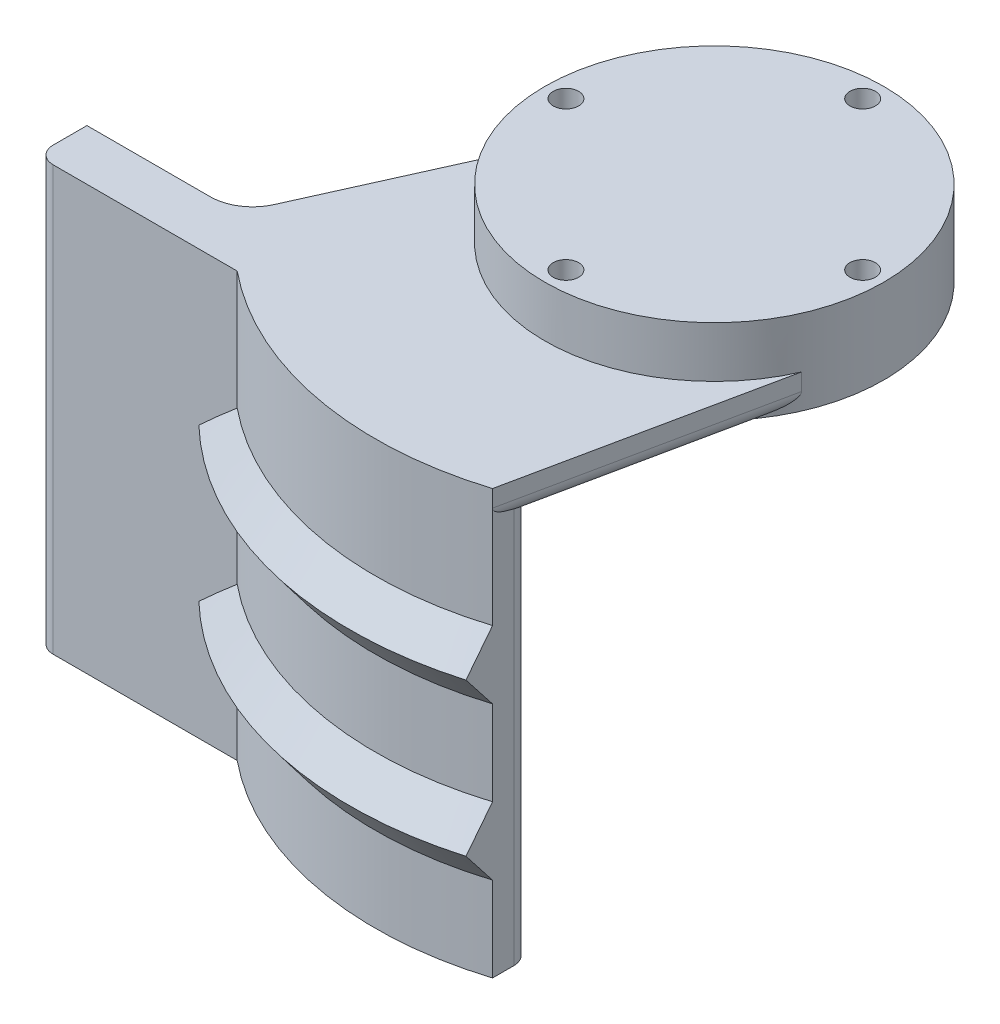
ISO-10303-21;
HEADER;
FILE_DESCRIPTION(('STEP AP214'),'2;1');
FILE_NAME('part.step','',(''),(''),'','','');
FILE_SCHEMA(('AUTOMOTIVE_DESIGN { 1 0 10303 214 1 1 1 1 }'));
ENDSEC;
DATA;
#1=APPLICATION_CONTEXT('core data for automotive mechanical design processes');
#2=APPLICATION_PROTOCOL_DEFINITION('international standard','automotive_design',2000,#1);
#3=PRODUCT_CONTEXT('',#1,'mechanical');
#4=PRODUCT('Part','Part','',(#3));
#5=PRODUCT_RELATED_PRODUCT_CATEGORY('part','',(#4));
#6=PRODUCT_DEFINITION_FORMATION('','',#4);
#7=PRODUCT_DEFINITION_CONTEXT('part definition',#1,'design');
#8=PRODUCT_DEFINITION('design','',#6,#7);
#9=PRODUCT_DEFINITION_SHAPE('','',#8);
#10=(LENGTH_UNIT() NAMED_UNIT(*) SI_UNIT(.MILLI.,.METRE.));
#11=(NAMED_UNIT(*) PLANE_ANGLE_UNIT() SI_UNIT($,.RADIAN.));
#12=(NAMED_UNIT(*) SI_UNIT($,.STERADIAN.) SOLID_ANGLE_UNIT());
#13=UNCERTAINTY_MEASURE_WITH_UNIT(LENGTH_MEASURE(1.E-05),#10,'distance_accuracy_value','');
#14=(GEOMETRIC_REPRESENTATION_CONTEXT(3) GLOBAL_UNCERTAINTY_ASSIGNED_CONTEXT((#13)) GLOBAL_UNIT_ASSIGNED_CONTEXT((#10,
#11,#12)) REPRESENTATION_CONTEXT('',''));
#15=CARTESIAN_POINT('',(0.,0.,0.));
#16=DIRECTION('',(0.,0.,1.));
#17=DIRECTION('',(1.,0.,0.));
#18=AXIS2_PLACEMENT_3D('',#15,#16,#17);
#19=CARTESIAN_POINT('',(0.,4.,0.));
#20=DIRECTION('',(0.,-1.,0.));
#21=DIRECTION('',(0.,0.,-1.));
#22=AXIS2_PLACEMENT_3D('',#19,#20,#21);
#23=CYLINDRICAL_SURFACE('',#22,40.);
#24=DIRECTION('',(0.,1.,0.));
#25=VECTOR('',#24,1.);
#26=CARTESIAN_POINT('',(12.,-50.,38.1575680566778));
#27=LINE('',#26,#25);
#28=CARTESIAN_POINT('',(12.,-46.,38.1575680566778));
#29=VERTEX_POINT('',#28);
#30=CARTESIAN_POINT('',(12.,-36.,38.1575680566778));
#31=VERTEX_POINT('',#30);
#32=EDGE_CURVE('E248',#29,#31,#27,.T.);
#33=ORIENTED_EDGE('',*,*,#32,.T.);
#34=CARTESIAN_POINT('',(0.,-36.,0.));
#35=DIRECTION('',(0.,1.,0.));
#36=DIRECTION('',(0.,0.,1.));
#37=AXIS2_PLACEMENT_3D('',#34,#35,#36);
#38=CIRCLE('',#37,40.);
#39=CARTESIAN_POINT('',(-25.2784493195291,-36.,31.));
#40=VERTEX_POINT('',#39);
#41=EDGE_CURVE('E140',#40,#31,#38,.T.);
#42=ORIENTED_EDGE('',*,*,#41,.F.);
#43=DIRECTION('',(0.,1.,0.));
#44=VECTOR('',#43,1.);
#45=CARTESIAN_POINT('',(-25.2784493195291,-46.,31.));
#46=LINE('',#45,#44);
#47=CARTESIAN_POINT('',(-25.2784493195291,-46.,31.));
#48=VERTEX_POINT('',#47);
#49=EDGE_CURVE('E163',#48,#40,#46,.T.);
#50=ORIENTED_EDGE('',*,*,#49,.F.);
#51=CARTESIAN_POINT('',(0.,-46.,0.));
#52=DIRECTION('',(0.,-1.,0.));
#53=DIRECTION('',(0.,0.,-1.));
#54=AXIS2_PLACEMENT_3D('',#51,#52,#53);
#55=CIRCLE('',#54,40.);
#56=EDGE_CURVE('E197',#48,#29,#55,.F.);
#57=ORIENTED_EDGE('',*,*,#56,.T.);
#58=EDGE_LOOP('',(#33,#42,#50,#57));
#59=FACE_BOUND('',#58,.T.);
#60=ADVANCED_FACE('F17',(#59),#23,.T.);
#61=CARTESIAN_POINT('',(0.,-32.,0.));
#62=DIRECTION('',(0.,1.,0.));
#63=DIRECTION('',(0.,0.,1.));
#64=AXIS2_PLACEMENT_3D('',#61,#62,#63);
#65=CONICAL_SURFACE('',#64,43.,0.643501108793284);
#66=CARTESIAN_POINT('',(12.,-36.,38.1575680566778));
#67=CARTESIAN_POINT('',(12.,-35.6671021168633,38.419296554204));
#68=CARTESIAN_POINT('',(12.,-35.3340868393737,38.6808757051275));
#69=CARTESIAN_POINT('',(12.,-34.6678346429777,39.2037511531911));
#70=CARTESIAN_POINT('',(12.,-34.334597724214,39.4650474505128));
#71=CARTESIAN_POINT('',(12.,-33.6679149859085,39.9873733504999));
#72=CARTESIAN_POINT('',(12.,-33.3344691663803,40.2484029531825));
#73=CARTESIAN_POINT('',(12.,-32.6673798864232,40.7702099359587));
#74=CARTESIAN_POINT('',(12.,-32.3337364258673,41.03098731589));
#75=CARTESIAN_POINT('',(12.,-32.,41.2916456441252));
#76=B_SPLINE_CURVE_WITH_KNOTS('',3,(#66,#67,#68,#69,#70,#71,#72,#73,#74,#75),.UNSPECIFIED.,.F.,
.F.,(4,2,2,2,4),(0.,1.27039564165171,2.54079046617746,3.81118520828206,5.08158076742941),.UNSPECIFIED.);
#77=CARTESIAN_POINT('',(12.,-32.,41.2916456441252));
#78=VERTEX_POINT('',#77);
#79=EDGE_CURVE('E150',#31,#78,#76,.T.);
#80=ORIENTED_EDGE('',*,*,#79,.T.);
#81=CARTESIAN_POINT('',(0.,-32.,0.));
#82=DIRECTION('',(0.,-1.,0.));
#83=DIRECTION('',(0.,0.,-1.));
#84=AXIS2_PLACEMENT_3D('',#81,#82,#83);
#85=CIRCLE('',#84,43.);
#86=CARTESIAN_POINT('',(-29.7993288515027,-32.,31.));
#87=VERTEX_POINT('',#86);
#88=EDGE_CURVE('E146',#87,#78,#85,.F.);
#89=ORIENTED_EDGE('',*,*,#88,.F.);
#90=CARTESIAN_POINT('',(-25.2784493195291,-36.,31.));
#91=CARTESIAN_POINT('',(-25.6631878364132,-35.6758002490935,31.));
#92=CARTESIAN_POINT('',(-26.0457436005517,-35.3490211030429,31.));
#93=CARTESIAN_POINT('',(-26.8067290436112,-34.6907909780192,31.));
#94=CARTESIAN_POINT('',(-27.1851592527072,-34.3593406122014,31.));
#95=CARTESIAN_POINT('',(-27.9382273306498,-33.6921754070855,31.));
#96=CARTESIAN_POINT('',(-28.31286525586,-33.3564606313356,31.));
#97=CARTESIAN_POINT('',(-29.0586582065725,-32.6810864184569,31.));
#98=CARTESIAN_POINT('',(-29.4298127728088,-32.3414264740257,31.));
#99=CARTESIAN_POINT('',(-29.7993288515027,-32.,31.));
#100=B_SPLINE_CURVE_WITH_KNOTS('',3,(#90,#91,#92,#93,#94,#95,#96,#97,#98,#99),.UNSPECIFIED.,.F.,
.F.,(4,2,2,2,4),(0.,1.50933691884322,3.01847753046414,4.5275956791798,6.03691007979028),.UNSPECIFIED.);
#101=EDGE_CURVE('E21',#40,#87,#100,.T.);
#102=ORIENTED_EDGE('',*,*,#101,.F.);
#103=ORIENTED_EDGE('',*,*,#41,.T.);
#104=EDGE_LOOP('',(#80,#89,#102,#103));
#105=FACE_BOUND('',#104,.T.);
#106=ADVANCED_FACE('F148',(#105),#65,.T.);
#107=CARTESIAN_POINT('',(0.,-32.,0.));
#108=DIRECTION('',(0.,-1.,0.));
#109=DIRECTION('',(0.,0.,-1.));
#110=AXIS2_PLACEMENT_3D('',#107,#108,#109);
#111=CONICAL_SURFACE('',#110,43.,0.643501108793284);
#112=ORIENTED_EDGE('',*,*,#88,.T.);
#113=CARTESIAN_POINT('',(12.,-32.,41.2916456441252));
#114=CARTESIAN_POINT('',(12.,-31.6662635741327,41.03098731589));
#115=CARTESIAN_POINT('',(12.,-31.3326201135769,40.7702099359587));
#116=CARTESIAN_POINT('',(12.,-30.6655308336197,40.2484029531825));
#117=CARTESIAN_POINT('',(12.,-30.3320850140915,39.9873733504999));
#118=CARTESIAN_POINT('',(12.,-29.665402275786,39.4650474505128));
#119=CARTESIAN_POINT('',(12.,-29.3321653570223,39.2037511531911));
#120=CARTESIAN_POINT('',(12.,-28.6659131606263,38.6808757051275));
#121=CARTESIAN_POINT('',(12.,-28.3328978831367,38.419296554204));
#122=CARTESIAN_POINT('',(12.,-28.,38.1575680566778));
#123=B_SPLINE_CURVE_WITH_KNOTS('',3,(#113,#114,#115,#116,#117,#118,#119,#120,#121,#122),
.UNSPECIFIED.,.F.,.F.,(4,2,2,2,4),(0.,1.27039555914734,2.54079030125196,3.81118512577771,
5.08158076742942),.UNSPECIFIED.);
#124=CARTESIAN_POINT('',(12.,-28.,38.1575680566778));
#125=VERTEX_POINT('',#124);
#126=EDGE_CURVE('E239',#78,#125,#123,.T.);
#127=ORIENTED_EDGE('',*,*,#126,.T.);
#128=CARTESIAN_POINT('',(0.,-28.,0.));
#129=DIRECTION('',(0.,-1.,0.));
#130=DIRECTION('',(0.,0.,-1.));
#131=AXIS2_PLACEMENT_3D('',#128,#129,#130);
#132=CIRCLE('',#131,40.);
#133=CARTESIAN_POINT('',(-25.2784493195291,-28.,31.));
#134=VERTEX_POINT('',#133);
#135=EDGE_CURVE('E155',#134,#125,#132,.F.);
#136=ORIENTED_EDGE('',*,*,#135,.F.);
#137=CARTESIAN_POINT('',(-29.7993288515027,-32.,31.));
#138=CARTESIAN_POINT('',(-29.4298127728088,-31.6585735259743,31.));
#139=CARTESIAN_POINT('',(-29.0586582065725,-31.3189135815431,31.));
#140=CARTESIAN_POINT('',(-28.31286525586,-30.6435393686644,31.));
#141=CARTESIAN_POINT('',(-27.9382273306498,-30.3078245929145,31.));
#142=CARTESIAN_POINT('',(-27.1851592527072,-29.6406593877986,31.));
#143=CARTESIAN_POINT('',(-26.8067290436112,-29.3092090219808,31.));
#144=CARTESIAN_POINT('',(-26.0457436005517,-28.6509788969571,31.));
#145=CARTESIAN_POINT('',(-25.6631878364132,-28.3241997509065,31.));
#146=CARTESIAN_POINT('',(-25.2784493195291,-28.,31.));
#147=B_SPLINE_CURVE_WITH_KNOTS('',3,(#137,#138,#139,#140,#141,#142,#143,#144,#145,#146),
.UNSPECIFIED.,.F.,.F.,(4,2,2,2,4),(0.,1.50931440061047,3.01843254932613,4.52757316094704,
6.03691007979026),.UNSPECIFIED.);
#148=EDGE_CURVE('E160',#87,#134,#147,.T.);
#149=ORIENTED_EDGE('',*,*,#148,.F.);
#150=EDGE_LOOP('',(#112,#127,#136,#149));
#151=FACE_BOUND('',#150,.T.);
#152=ADVANCED_FACE('F164',(#151),#111,.T.);
#153=CARTESIAN_POINT('',(0.,4.,0.));
#154=DIRECTION('',(0.,-1.,0.));
#155=DIRECTION('',(0.,0.,-1.));
#156=AXIS2_PLACEMENT_3D('',#153,#154,#155);
#157=CYLINDRICAL_SURFACE('',#156,40.);
#158=DIRECTION('',(0.,1.,0.));
#159=VECTOR('',#158,1.);
#160=CARTESIAN_POINT('',(12.,-50.,38.1575680566778));
#161=LINE('',#160,#159);
#162=CARTESIAN_POINT('',(12.,-18.,38.1575680566778));
#163=VERTEX_POINT('',#162);
#164=EDGE_CURVE('E243',#125,#163,#161,.T.);
#165=ORIENTED_EDGE('',*,*,#164,.T.);
#166=CARTESIAN_POINT('',(0.,-18.,0.));
#167=DIRECTION('',(0.,1.,0.));
#168=DIRECTION('',(0.,0.,1.));
#169=AXIS2_PLACEMENT_3D('',#166,#167,#168);
#170=CIRCLE('',#169,40.);
#171=CARTESIAN_POINT('',(-25.2784493195291,-18.,31.));
#172=VERTEX_POINT('',#171);
#173=EDGE_CURVE('E392',#172,#163,#170,.T.);
#174=ORIENTED_EDGE('',*,*,#173,.F.);
#175=DIRECTION('',(0.,1.,0.));
#176=VECTOR('',#175,1.);
#177=CARTESIAN_POINT('',(-25.2784493195291,-46.,31.));
#178=LINE('',#177,#176);
#179=EDGE_CURVE('E166',#134,#172,#178,.T.);
#180=ORIENTED_EDGE('',*,*,#179,.F.);
#181=ORIENTED_EDGE('',*,*,#135,.T.);
#182=EDGE_LOOP('',(#165,#174,#180,#181));
#183=FACE_BOUND('',#182,.T.);
#184=ADVANCED_FACE('F527',(#183),#157,.T.);
#185=CARTESIAN_POINT('',(0.,-14.,0.));
#186=DIRECTION('',(0.,1.,0.));
#187=DIRECTION('',(0.,0.,1.));
#188=AXIS2_PLACEMENT_3D('',#185,#186,#187);
#189=CONICAL_SURFACE('',#188,43.,0.643501108793285);
#190=CARTESIAN_POINT('',(12.,-18.,38.1575680566778));
#191=CARTESIAN_POINT('',(12.,-17.6671021168633,38.419296554204));
#192=CARTESIAN_POINT('',(12.,-17.3340868393737,38.6808757051275));
#193=CARTESIAN_POINT('',(12.,-16.6678346429777,39.2037511531911));
#194=CARTESIAN_POINT('',(12.,-16.334597724214,39.4650474505128));
#195=CARTESIAN_POINT('',(12.,-15.6679149859085,39.9873733504999));
#196=CARTESIAN_POINT('',(12.,-15.3344691663803,40.2484029531825));
#197=CARTESIAN_POINT('',(12.,-14.6673798864232,40.7702099359587));
#198=CARTESIAN_POINT('',(12.,-14.3337364258673,41.03098731589));
#199=CARTESIAN_POINT('',(12.,-14.,41.2916456441252));
#200=B_SPLINE_CURVE_WITH_KNOTS('',3,(#190,#191,#192,#193,#194,#195,#196,#197,#198,#199),
.UNSPECIFIED.,.F.,.F.,(4,2,2,2,4),(0.,1.27039564165171,2.54079046617745,3.81118520828205,
5.0815807674294),.UNSPECIFIED.);
#201=CARTESIAN_POINT('',(12.,-14.,41.2916456441252));
#202=VERTEX_POINT('',#201);
#203=EDGE_CURVE('E217',#163,#202,#200,.T.);
#204=ORIENTED_EDGE('',*,*,#203,.T.);
#205=CARTESIAN_POINT('',(0.,-14.,0.));
#206=DIRECTION('',(0.,-1.,0.));
#207=DIRECTION('',(0.,0.,-1.));
#208=AXIS2_PLACEMENT_3D('',#205,#206,#207);
#209=CIRCLE('',#208,43.);
#210=CARTESIAN_POINT('',(-29.7993288515027,-14.,31.));
#211=VERTEX_POINT('',#210);
#212=EDGE_CURVE('E385',#211,#202,#209,.F.);
#213=ORIENTED_EDGE('',*,*,#212,.F.);
#214=CARTESIAN_POINT('',(-25.2784493195291,-18.,31.));
#215=CARTESIAN_POINT('',(-25.6631878364132,-17.6758002490935,31.));
#216=CARTESIAN_POINT('',(-26.0457436005517,-17.3490211030429,31.));
#217=CARTESIAN_POINT('',(-26.8067290436112,-16.6907909780192,31.));
#218=CARTESIAN_POINT('',(-27.1851592527072,-16.3593406122014,31.));
#219=CARTESIAN_POINT('',(-27.9382273306498,-15.6921754070855,31.));
#220=CARTESIAN_POINT('',(-28.31286525586,-15.3564606313356,31.));
#221=CARTESIAN_POINT('',(-29.0586582065725,-14.6810864184569,31.));
#222=CARTESIAN_POINT('',(-29.4298127728088,-14.3414264740257,31.));
#223=CARTESIAN_POINT('',(-29.7993288515027,-14.,31.));
#224=B_SPLINE_CURVE_WITH_KNOTS('',3,(#214,#215,#216,#217,#218,#219,#220,#221,#222,#223),
.UNSPECIFIED.,.F.,.F.,(4,2,2,2,4),(0.,1.50933691884322,3.01847753046413,4.52759567917979,
6.03691007979027),.UNSPECIFIED.);
#225=EDGE_CURVE('E167',#172,#211,#224,.T.);
#226=ORIENTED_EDGE('',*,*,#225,.F.);
#227=ORIENTED_EDGE('',*,*,#173,.T.);
#228=EDGE_LOOP('',(#204,#213,#226,#227));
#229=FACE_BOUND('',#228,.T.);
#230=ADVANCED_FACE('F203',(#229),#189,.T.);
#231=CARTESIAN_POINT('',(0.,-14.,0.));
#232=DIRECTION('',(0.,-1.,0.));
#233=DIRECTION('',(0.,0.,-1.));
#234=AXIS2_PLACEMENT_3D('',#231,#232,#233);
#235=CONICAL_SURFACE('',#234,43.,0.643501108793285);
#236=ORIENTED_EDGE('',*,*,#212,.T.);
#237=CARTESIAN_POINT('',(12.,-14.,41.2916456441252));
#238=CARTESIAN_POINT('',(12.,-13.6662635741327,41.03098731589));
#239=CARTESIAN_POINT('',(12.,-13.3326201135769,40.7702099359587));
#240=CARTESIAN_POINT('',(12.,-12.6655308336197,40.2484029531825));
#241=CARTESIAN_POINT('',(12.,-12.3320850140915,39.9873733504999));
#242=CARTESIAN_POINT('',(12.,-11.665402275786,39.4650474505128));
#243=CARTESIAN_POINT('',(12.,-11.3321653570223,39.2037511531911));
#244=CARTESIAN_POINT('',(12.,-10.6659131606263,38.6808757051275));
#245=CARTESIAN_POINT('',(12.,-10.3328978831367,38.419296554204));
#246=CARTESIAN_POINT('',(12.,-10.,38.1575680566778));
#247=B_SPLINE_CURVE_WITH_KNOTS('',3,(#237,#238,#239,#240,#241,#242,#243,#244,#245,#246),
.UNSPECIFIED.,.F.,.F.,(4,2,2,2,4),(0.,1.27039555914735,2.54079030125195,3.8111851257777,
5.0815807674294),.UNSPECIFIED.);
#248=CARTESIAN_POINT('',(12.,-10.,38.1575680566778));
#249=VERTEX_POINT('',#248);
#250=EDGE_CURVE('E208',#202,#249,#247,.T.);
#251=ORIENTED_EDGE('',*,*,#250,.T.);
#252=CARTESIAN_POINT('',(0.,-10.,0.));
#253=DIRECTION('',(0.,-1.,0.));
#254=DIRECTION('',(0.,0.,-1.));
#255=AXIS2_PLACEMENT_3D('',#252,#253,#254);
#256=CIRCLE('',#255,40.);
#257=CARTESIAN_POINT('',(-25.2784493195291,-10.,31.));
#258=VERTEX_POINT('',#257);
#259=EDGE_CURVE('E380',#258,#249,#256,.F.);
#260=ORIENTED_EDGE('',*,*,#259,.F.);
#261=CARTESIAN_POINT('',(-29.7993288515027,-14.,31.));
#262=CARTESIAN_POINT('',(-29.4298127728088,-13.6585735259743,31.));
#263=CARTESIAN_POINT('',(-29.0586582065725,-13.3189135815431,31.));
#264=CARTESIAN_POINT('',(-28.31286525586,-12.6435393686644,31.));
#265=CARTESIAN_POINT('',(-27.9382273306498,-12.3078245929145,31.));
#266=CARTESIAN_POINT('',(-27.1851592527072,-11.6406593877986,31.));
#267=CARTESIAN_POINT('',(-26.8067290436112,-11.3092090219808,31.));
#268=CARTESIAN_POINT('',(-26.0457436005517,-10.6509788969572,31.));
#269=CARTESIAN_POINT('',(-25.6631878364132,-10.3241997509065,31.));
#270=CARTESIAN_POINT('',(-25.2784493195291,-10.,31.));
#271=B_SPLINE_CURVE_WITH_KNOTS('',3,(#261,#262,#263,#264,#265,#266,#267,#268,#269,#270),
.UNSPECIFIED.,.F.,.F.,(4,2,2,2,4),(0.,1.50931440061048,3.01843254932613,4.52757316094705,
6.03691007979026),.UNSPECIFIED.);
#272=EDGE_CURVE('E190',#211,#258,#271,.T.);
#273=ORIENTED_EDGE('',*,*,#272,.F.);
#274=EDGE_LOOP('',(#236,#251,#260,#273));
#275=FACE_BOUND('',#274,.T.);
#276=ADVANCED_FACE('F199',(#275),#235,.T.);
#277=CARTESIAN_POINT('',(-47.,-46.,29.));
#278=DIRECTION('',(0.,1.,0.));
#279=DIRECTION('',(0.,0.,1.));
#280=AXIS2_PLACEMENT_3D('',#277,#278,#279);
#281=CYLINDRICAL_SURFACE('',#280,2.);
#282=CARTESIAN_POINT('',(-47.,4.,29.));
#283=DIRECTION('',(0.,1.,0.));
#284=DIRECTION('',(0.,0.,1.));
#285=AXIS2_PLACEMENT_3D('',#282,#283,#284);
#286=CIRCLE('',#285,2.);
#287=CARTESIAN_POINT('',(-49.,4.,29.));
#288=VERTEX_POINT('',#287);
#289=CARTESIAN_POINT('',(-47.,4.,31.));
#290=VERTEX_POINT('',#289);
#291=EDGE_CURVE('E218',#288,#290,#286,.T.);
#292=ORIENTED_EDGE('',*,*,#291,.F.);
#293=DIRECTION('',(0.,1.,0.));
#294=VECTOR('',#293,1.);
#295=CARTESIAN_POINT('',(-49.,-46.,29.));
#296=LINE('',#295,#294);
#297=CARTESIAN_POINT('',(-49.,-46.,29.));
#298=VERTEX_POINT('',#297);
#299=EDGE_CURVE('E386',#298,#288,#296,.T.);
#300=ORIENTED_EDGE('',*,*,#299,.F.);
#301=CARTESIAN_POINT('',(-47.,-46.,29.));
#302=DIRECTION('',(0.,1.,0.));
#303=DIRECTION('',(0.,0.,1.));
#304=AXIS2_PLACEMENT_3D('',#301,#302,#303);
#305=CIRCLE('',#304,2.);
#306=CARTESIAN_POINT('',(-47.,-46.,31.));
#307=VERTEX_POINT('',#306);
#308=EDGE_CURVE('E354',#298,#307,#305,.T.);
#309=ORIENTED_EDGE('',*,*,#308,.T.);
#310=DIRECTION('',(0.,1.,0.));
#311=VECTOR('',#310,1.);
#312=CARTESIAN_POINT('',(-47.,-46.,31.));
#313=LINE('',#312,#311);
#314=EDGE_CURVE('E383',#290,#307,#313,.F.);
#315=ORIENTED_EDGE('',*,*,#314,.F.);
#316=EDGE_LOOP('',(#292,#300,#309,#315));
#317=FACE_BOUND('',#316,.T.);
#318=ADVANCED_FACE('F185',(#317),#281,.T.);
#319=CARTESIAN_POINT('',(-24.4948974278318,-46.,31.));
#320=DIRECTION('',(0.,0.,1.));
#321=DIRECTION('',(1.,0.,0.));
#322=AXIS2_PLACEMENT_3D('',#319,#320,#321);
#323=PLANE('',#322);
#324=ORIENTED_EDGE('',*,*,#272,.T.);
#325=DIRECTION('',(0.,-1.,0.));
#326=VECTOR('',#325,1.);
#327=CARTESIAN_POINT('',(-25.2784493195291,4.,31.));
#328=LINE('',#327,#326);
#329=CARTESIAN_POINT('',(-25.2784493195291,4.,31.));
#330=VERTEX_POINT('',#329);
#331=EDGE_CURVE('E196',#330,#258,#328,.T.);
#332=ORIENTED_EDGE('',*,*,#331,.F.);
#333=DIRECTION('',(1.,0.,0.));
#334=VECTOR('',#333,1.);
#335=CARTESIAN_POINT('',(0.,4.,31.));
#336=LINE('',#335,#334);
#337=EDGE_CURVE('E324',#290,#330,#336,.T.);
#338=ORIENTED_EDGE('',*,*,#337,.F.);
#339=ORIENTED_EDGE('',*,*,#314,.T.);
#340=DIRECTION('',(1.,0.,0.));
#341=VECTOR('',#340,1.);
#342=CARTESIAN_POINT('',(0.,-46.,31.));
#343=LINE('',#342,#341);
#344=EDGE_CURVE('E351',#307,#48,#343,.T.);
#345=ORIENTED_EDGE('',*,*,#344,.T.);
#346=ORIENTED_EDGE('',*,*,#49,.T.);
#347=ORIENTED_EDGE('',*,*,#101,.T.);
#348=ORIENTED_EDGE('',*,*,#148,.T.);
#349=ORIENTED_EDGE('',*,*,#179,.T.);
#350=ORIENTED_EDGE('',*,*,#225,.T.);
#351=EDGE_LOOP('',(#324,#332,#338,#339,#345,#346,#347,#348,#349,#350));
#352=FACE_BOUND('',#351,.T.);
#353=ADVANCED_FACE('F158',(#352),#323,.T.);
#354=CARTESIAN_POINT('',(0.,4.,0.));
#355=DIRECTION('',(0.,-1.,0.));
#356=DIRECTION('',(0.,0.,-1.));
#357=AXIS2_PLACEMENT_3D('',#354,#355,#356);
#358=CYLINDRICAL_SURFACE('',#357,40.);
#359=ORIENTED_EDGE('',*,*,#331,.T.);
#360=ORIENTED_EDGE('',*,*,#259,.T.);
#361=DIRECTION('',(0.,1.,0.));
#362=VECTOR('',#361,1.);
#363=CARTESIAN_POINT('',(12.,-50.,38.1575680566778));
#364=LINE('',#363,#362);
#365=CARTESIAN_POINT('',(12.,2.,38.1575680566778));
#366=VERTEX_POINT('',#365);
#367=EDGE_CURVE('E216',#249,#366,#364,.T.);
#368=ORIENTED_EDGE('',*,*,#367,.T.);
#369=DIRECTION('',(0.,1.,0.));
#370=VECTOR('',#369,1.);
#371=CARTESIAN_POINT('',(12.,5.,38.1575680566778));
#372=LINE('',#371,#370);
#373=CARTESIAN_POINT('',(12.,4.,38.1575680566778));
#374=VERTEX_POINT('',#373);
#375=EDGE_CURVE('E321',#366,#374,#372,.T.);
#376=ORIENTED_EDGE('',*,*,#375,.T.);
#377=CARTESIAN_POINT('',(0.,4.,0.));
#378=DIRECTION('',(0.,-1.,0.));
#379=DIRECTION('',(0.,0.,-1.));
#380=AXIS2_PLACEMENT_3D('',#377,#378,#379);
#381=CIRCLE('',#380,40.);
#382=EDGE_CURVE('E322',#330,#374,#381,.F.);
#383=ORIENTED_EDGE('',*,*,#382,.F.);
#384=EDGE_LOOP('',(#359,#360,#368,#376,#383));
#385=FACE_BOUND('',#384,.T.);
#386=ADVANCED_FACE('F184',(#385),#358,.T.);
#387=CARTESIAN_POINT('',(0.,8.,0.));
#388=DIRECTION('',(0.,1.,0.));
#389=DIRECTION('',(0.,0.,1.));
#390=AXIS2_PLACEMENT_3D('',#387,#388,#389);
#391=PLANE('',#390);
#392=CARTESIAN_POINT('',(0.,8.,0.));
#393=DIRECTION('',(0.,-1.,0.));
#394=DIRECTION('',(0.,0.,-1.));
#395=AXIS2_PLACEMENT_3D('',#392,#393,#394);
#396=CIRCLE('',#395,7.5);
#397=CARTESIAN_POINT('',(0.,8.,-7.5));
#398=VERTEX_POINT('',#397);
#399=EDGE_CURVE('E319',#398,#398,#396,.T.);
#400=ORIENTED_EDGE('',*,*,#399,.T.);
#401=EDGE_LOOP('',(#400));
#402=FACE_BOUND('',#401,.T.);
#403=ADVANCED_FACE('F435',(#402),#391,.F.);
#404=CARTESIAN_POINT('',(-49.,-46.,25.));
#405=DIRECTION('',(-1.,0.,0.));
#406=DIRECTION('',(0.,0.,1.));
#407=AXIS2_PLACEMENT_3D('',#404,#405,#406);
#408=PLANE('',#407);
#409=DIRECTION('',(0.,0.,1.));
#410=VECTOR('',#409,1.);
#411=CARTESIAN_POINT('',(-49.,4.,0.));
#412=LINE('',#411,#410);
#413=CARTESIAN_POINT('',(-49.,4.,25.));
#414=VERTEX_POINT('',#413);
#415=EDGE_CURVE('E333',#414,#288,#412,.T.);
#416=ORIENTED_EDGE('',*,*,#415,.F.);
#417=DIRECTION('',(0.,1.,0.));
#418=VECTOR('',#417,1.);
#419=CARTESIAN_POINT('',(-49.,-50.,25.));
#420=LINE('',#419,#418);
#421=CARTESIAN_POINT('',(-49.,-46.,25.));
#422=VERTEX_POINT('',#421);
#423=EDGE_CURVE('E304',#414,#422,#420,.F.);
#424=ORIENTED_EDGE('',*,*,#423,.T.);
#425=DIRECTION('',(0.,0.,1.));
#426=VECTOR('',#425,1.);
#427=CARTESIAN_POINT('',(-49.,-46.,0.));
#428=LINE('',#427,#426);
#429=EDGE_CURVE('E355',#422,#298,#428,.T.);
#430=ORIENTED_EDGE('',*,*,#429,.T.);
#431=ORIENTED_EDGE('',*,*,#299,.T.);
#432=EDGE_LOOP('',(#416,#424,#430,#431));
#433=FACE_BOUND('',#432,.T.);
#434=ADVANCED_FACE('F437',(#433),#408,.T.);
#435=CARTESIAN_POINT('',(0.,-46.,0.));
#436=DIRECTION('',(0.,1.,0.));
#437=DIRECTION('',(0.,0.,1.));
#438=AXIS2_PLACEMENT_3D('',#435,#436,#437);
#439=PLANE('',#438);
#440=ORIENTED_EDGE('',*,*,#308,.F.);
#441=ORIENTED_EDGE('',*,*,#429,.F.);
#442=DIRECTION('',(1.,0.,0.));
#443=VECTOR('',#442,1.);
#444=CARTESIAN_POINT('',(-50.,-46.,25.));
#445=LINE('',#444,#443);
#446=CARTESIAN_POINT('',(-24.4948974278318,-46.,25.));
#447=VERTEX_POINT('',#446);
#448=EDGE_CURVE('E360',#422,#447,#445,.T.);
#449=ORIENTED_EDGE('',*,*,#448,.T.);
#450=CARTESIAN_POINT('',(0.,-46.,0.));
#451=DIRECTION('',(0.,1.,0.));
#452=DIRECTION('',(0.,0.,1.));
#453=AXIS2_PLACEMENT_3D('',#450,#451,#452);
#454=CIRCLE('',#453,35.);
#455=CARTESIAN_POINT('',(9.45945945945946,-46.,33.6974572740265));
#456=VERTEX_POINT('',#455);
#457=EDGE_CURVE('E298',#447,#456,#454,.T.);
#458=ORIENTED_EDGE('',*,*,#457,.T.);
#459=CARTESIAN_POINT('',(10.,-46.,35.6230262611138));
#460=DIRECTION('',(0.,1.,0.));
#461=DIRECTION('',(0.,0.,1.));
#462=AXIS2_PLACEMENT_3D('',#459,#460,#461);
#463=CIRCLE('',#462,2.);
#464=CARTESIAN_POINT('',(12.,-46.,35.6230262611138));
#465=VERTEX_POINT('',#464);
#466=EDGE_CURVE('E249',#465,#456,#463,.T.);
#467=ORIENTED_EDGE('',*,*,#466,.F.);
#468=DIRECTION('',(0.,0.,1.));
#469=VECTOR('',#468,1.);
#470=CARTESIAN_POINT('',(12.,-46.,25.));
#471=LINE('',#470,#469);
#472=EDGE_CURVE('E338',#465,#29,#471,.T.);
#473=ORIENTED_EDGE('',*,*,#472,.T.);
#474=ORIENTED_EDGE('',*,*,#56,.F.);
#475=ORIENTED_EDGE('',*,*,#344,.F.);
#476=EDGE_LOOP('',(#440,#441,#449,#458,#467,#473,#474,#475));
#477=FACE_BOUND('',#476,.T.);
#478=ADVANCED_FACE('F442',(#477),#439,.F.);
#479=CARTESIAN_POINT('',(10.,-46.,35.6230262611138));
#480=DIRECTION('',(0.,1.,0.));
#481=DIRECTION('',(0.,0.,1.));
#482=AXIS2_PLACEMENT_3D('',#479,#480,#481);
#483=CYLINDRICAL_SURFACE('',#482,2.);
#484=ORIENTED_EDGE('',*,*,#466,.T.);
#485=DIRECTION('',(0.,1.,0.));
#486=VECTOR('',#485,1.);
#487=CARTESIAN_POINT('',(9.45945945945946,-46.,33.6974572740265));
#488=LINE('',#487,#486);
#489=CARTESIAN_POINT('',(9.45945945945946,0.,33.6974572740265));
#490=VERTEX_POINT('',#489);
#491=EDGE_CURVE('E301',#456,#490,#488,.T.);
#492=ORIENTED_EDGE('',*,*,#491,.T.);
#493=CARTESIAN_POINT('',(10.,0.,35.6230262611138));
#494=DIRECTION('',(0.,1.,0.));
#495=DIRECTION('',(0.,0.,1.));
#496=AXIS2_PLACEMENT_3D('',#493,#494,#495);
#497=CIRCLE('',#496,2.);
#498=CARTESIAN_POINT('',(10.8658801079135,0.,33.8201808327091));
#499=VERTEX_POINT('',#498);
#500=EDGE_CURVE('E353',#490,#499,#497,.F.);
#501=ORIENTED_EDGE('',*,*,#500,.T.);
#502=CARTESIAN_POINT('',(12.,0.654701548809647,35.6230262611138));
#503=CARTESIAN_POINT('',(11.9999943910202,0.641671996928392,35.5653380243583));
#504=CARTESIAN_POINT('',(11.9975046261381,0.626445888664187,35.50823924342));
#505=CARTESIAN_POINT('',(11.9878243493848,0.592741837903215,35.3955371470317));
#506=CARTESIAN_POINT('',(11.9806439281242,0.574270937867632,35.3399308875689));
#507=CARTESIAN_POINT('',(11.9618614326685,0.535181901281663,35.2303617034271));
#508=CARTESIAN_POINT('',(11.9502658557859,0.51456695214678,35.1763964892133));
#509=CARTESIAN_POINT('',(11.9228199401432,0.472067124709747,35.0700529024517));
#510=CARTESIAN_POINT('',(11.9069670756031,0.450181498596648,35.0176754925185));
#511=CARTESIAN_POINT('',(11.8534677789075,0.384165384048488,34.863815168216));
#512=CARTESIAN_POINT('',(11.8097197730592,0.339322807116525,34.7646908093118));
#513=CARTESIAN_POINT('',(11.7060486730404,0.252859498332997,34.5736478400383));
#514=CARTESIAN_POINT('',(11.6461193522622,0.211240014685121,34.4817320211388));
#515=CARTESIAN_POINT('',(11.5211683951688,0.141982511963891,34.3212456240261));
#516=CARTESIAN_POINT('',(11.4585633972876,0.113171399703694,34.2513103628373));
#517=CARTESIAN_POINT('',(11.3225219568855,0.06389408664191,34.1197526742166));
#518=CARTESIAN_POINT('',(11.2491223031046,0.0434003980624164,34.0581033225493));
#519=CARTESIAN_POINT('',(11.1233735643143,0.0192614810202761,33.9672844506969));
#520=CARTESIAN_POINT('',(11.0740203784103,0.012161481730388,33.9348426074582));
#521=CARTESIAN_POINT('',(10.9721572324881,0.00251465841555722,33.8741825159953));
#522=CARTESIAN_POINT('',(10.9196377920037,-1.77101021580285E-05,33.8459779349844));
#523=CARTESIAN_POINT('',(10.8658801079135,0.,33.8201808327091));
#524=B_SPLINE_CURVE_WITH_KNOTS('',3,(#502,#503,#504,#505,#506,#507,#508,#509,#510,#511,#512,
#513,#514,#515,#516,#517,#518,#519,#520,#521,#522,#523),.UNSPECIFIED.,.F.,.F.,(4,2,2,2,2,2,2,2,
2,2,4),(0.,0.17719808853852,0.354016235625674,0.530575177756906,0.707239101759139,
1.05762120491327,1.40813832854332,1.70160191616098,1.99408759670421,2.17216907005459,
2.35081314823571),.UNSPECIFIED.);
#525=CARTESIAN_POINT('',(12.,0.65470154880964,35.6230262611138));
#526=VERTEX_POINT('',#525);
#527=EDGE_CURVE('E292',#526,#499,#524,.T.);
#528=ORIENTED_EDGE('',*,*,#527,.F.);
#529=DIRECTION('',(0.,1.,0.));
#530=VECTOR('',#529,1.);
#531=CARTESIAN_POINT('',(12.,-50.,35.6230262611138));
#532=LINE('',#531,#530);
#533=EDGE_CURVE('E341',#526,#465,#532,.F.);
#534=ORIENTED_EDGE('',*,*,#533,.T.);
#535=EDGE_LOOP('',(#484,#492,#501,#528,#534));
#536=FACE_BOUND('',#535,.T.);
#537=ADVANCED_FACE('F230',(#536),#483,.T.);
#538=CARTESIAN_POINT('',(12.,-50.,25.));
#539=DIRECTION('',(-1.,0.,0.));
#540=DIRECTION('',(0.,0.,1.));
#541=AXIS2_PLACEMENT_3D('',#538,#539,#540);
#542=PLANE('',#541);
#543=ORIENTED_EDGE('',*,*,#533,.F.);
#544=CARTESIAN_POINT('',(12.,2.,28.4107737118688));
#545=DIRECTION('',(-1.,0.,0.));
#546=DIRECTION('',(0.,0.,-1.));
#547=AXIS2_PLACEMENT_3D('',#544,#545,#546);
#548=ELLIPSE('',#547,9.74679434480896,2.);
#549=EDGE_CURVE('E288',#366,#526,#548,.F.);
#550=ORIENTED_EDGE('',*,*,#549,.F.);
#551=ORIENTED_EDGE('',*,*,#367,.F.);
#552=ORIENTED_EDGE('',*,*,#250,.F.);
#553=ORIENTED_EDGE('',*,*,#203,.F.);
#554=ORIENTED_EDGE('',*,*,#164,.F.);
#555=ORIENTED_EDGE('',*,*,#126,.F.);
#556=ORIENTED_EDGE('',*,*,#79,.F.);
#557=ORIENTED_EDGE('',*,*,#32,.F.);
#558=ORIENTED_EDGE('',*,*,#472,.F.);
#559=EDGE_LOOP('',(#543,#550,#551,#552,#553,#554,#555,#556,#557,#558));
#560=FACE_BOUND('',#559,.T.);
#561=ADVANCED_FACE('F224',(#560),#542,.F.);
#562=CARTESIAN_POINT('',(0.,10.,0.));
#563=DIRECTION('',(0.,1.,0.));
#564=DIRECTION('',(0.,0.,1.));
#565=AXIS2_PLACEMENT_3D('',#562,#563,#564);
#566=PLANE('',#565);
#567=CARTESIAN_POINT('',(0.,10.,0.));
#568=DIRECTION('',(0.,-1.,0.));
#569=DIRECTION('',(0.,0.,-1.));
#570=AXIS2_PLACEMENT_3D('',#567,#568,#569);
#571=CIRCLE('',#570,20.);
#572=CARTESIAN_POINT('',(0.,10.,-20.));
#573=VERTEX_POINT('',#572);
#574=EDGE_CURVE('E285',#573,#573,#571,.T.);
#575=ORIENTED_EDGE('',*,*,#574,.F.);
#576=EDGE_LOOP('',(#575));
#577=FACE_BOUND('',#576,.T.);
#578=CARTESIAN_POINT('',(0.,10.,-17.5));
#579=DIRECTION('',(0.,-1.,0.));
#580=DIRECTION('',(0.,0.,-1.));
#581=AXIS2_PLACEMENT_3D('',#578,#579,#580);
#582=CIRCLE('',#581,1.5);
#583=CARTESIAN_POINT('',(0.,10.,-19.));
#584=VERTEX_POINT('',#583);
#585=EDGE_CURVE('E306',#584,#584,#582,.T.);
#586=ORIENTED_EDGE('',*,*,#585,.T.);
#587=EDGE_LOOP('',(#586));
#588=FACE_BOUND('',#587,.T.);
#589=CARTESIAN_POINT('',(-17.5,10.,0.));
#590=DIRECTION('',(0.,-1.,0.));
#591=DIRECTION('',(0.,0.,-1.));
#592=AXIS2_PLACEMENT_3D('',#589,#590,#591);
#593=CIRCLE('',#592,1.50000000000018);
#594=CARTESIAN_POINT('',(-17.5,10.,-1.50000000000018));
#595=VERTEX_POINT('',#594);
#596=EDGE_CURVE('E310',#595,#595,#593,.T.);
#597=ORIENTED_EDGE('',*,*,#596,.T.);
#598=EDGE_LOOP('',(#597));
#599=FACE_BOUND('',#598,.T.);
#600=CARTESIAN_POINT('',(0.,10.,17.5));
#601=DIRECTION('',(0.,-1.,0.));
#602=DIRECTION('',(0.,0.,-1.));
#603=AXIS2_PLACEMENT_3D('',#600,#601,#602);
#604=CIRCLE('',#603,1.50000000000012);
#605=CARTESIAN_POINT('',(0.,10.,15.9999999999999));
#606=VERTEX_POINT('',#605);
#607=EDGE_CURVE('E313',#606,#606,#604,.T.);
#608=ORIENTED_EDGE('',*,*,#607,.T.);
#609=EDGE_LOOP('',(#608));
#610=FACE_BOUND('',#609,.T.);
#611=CARTESIAN_POINT('',(17.5,10.,0.));
#612=DIRECTION('',(0.,-1.,0.));
#613=DIRECTION('',(0.,0.,-1.));
#614=AXIS2_PLACEMENT_3D('',#611,#612,#613);
#615=CIRCLE('',#614,1.50000000000006);
#616=CARTESIAN_POINT('',(17.5,10.,-1.50000000000006));
#617=VERTEX_POINT('',#616);
#618=EDGE_CURVE('E316',#617,#617,#615,.T.);
#619=ORIENTED_EDGE('',*,*,#618,.T.);
#620=EDGE_LOOP('',(#619));
#621=FACE_BOUND('',#620,.T.);
#622=ADVANCED_FACE('F229',(#577,#588,#599,#610,#621),#566,.T.);
#623=CARTESIAN_POINT('',(0.,4.,0.));
#624=DIRECTION('',(0.,1.,0.));
#625=DIRECTION('',(0.,0.,1.));
#626=AXIS2_PLACEMENT_3D('',#623,#624,#625);
#627=PLANE('',#626);
#628=CARTESIAN_POINT('',(-34.4608692968009,4.,20.));
#629=DIRECTION('',(0.,1.,0.));
#630=DIRECTION('',(0.,0.,1.));
#631=AXIS2_PLACEMENT_3D('',#628,#629,#630);
#632=CIRCLE('',#631,5.);
#633=CARTESIAN_POINT('',(-29.899555730199,4.,22.0480279654178));
#634=VERTEX_POINT('',#633);
#635=CARTESIAN_POINT('',(-34.4608692968009,4.,25.));
#636=VERTEX_POINT('',#635);
#637=EDGE_CURVE('E302',#634,#636,#632,.F.);
#638=ORIENTED_EDGE('',*,*,#637,.T.);
#639=DIRECTION('',(1.,0.,0.));
#640=VECTOR('',#639,1.);
#641=CARTESIAN_POINT('',(-50.,4.,25.));
#642=LINE('',#641,#640);
#643=EDGE_CURVE('E366',#636,#414,#642,.F.);
#644=ORIENTED_EDGE('',*,*,#643,.T.);
#645=ORIENTED_EDGE('',*,*,#415,.T.);
#646=ORIENTED_EDGE('',*,*,#291,.T.);
#647=ORIENTED_EDGE('',*,*,#337,.T.);
#648=ORIENTED_EDGE('',*,*,#382,.T.);
#649=DIRECTION('',(-0.205195670417031,0.,0.978720969859186));
#650=VECTOR('',#649,1.);
#651=CARTESIAN_POINT('',(19.1578947368421,4.,4.01658611122924));
#652=LINE('',#651,#650);
#653=CARTESIAN_POINT('',(18.3157894736842,4.,8.03317222245847));
#654=VERTEX_POINT('',#653);
#655=EDGE_CURVE('E323',#374,#654,#652,.F.);
#656=ORIENTED_EDGE('',*,*,#655,.T.);
#657=CARTESIAN_POINT('',(0.,4.,0.));
#658=DIRECTION('',(0.,-1.,0.));
#659=DIRECTION('',(0.,0.,-1.));
#660=AXIS2_PLACEMENT_3D('',#657,#658,#659);
#661=CIRCLE('',#660,20.);
#662=CARTESIAN_POINT('',(-20.,4.,0.));
#663=VERTEX_POINT('',#662);
#664=EDGE_CURVE('E283',#663,#654,#661,.F.);
#665=ORIENTED_EDGE('',*,*,#664,.F.);
#666=DIRECTION('',(-0.409605593083552,0.,0.912262713320386));
#667=VECTOR('',#666,1.);
#668=CARTESIAN_POINT('',(-16.6444651622934,4.,-7.47335819475213));
#669=LINE('',#668,#667);
#670=EDGE_CURVE('E309',#634,#663,#669,.F.);
#671=ORIENTED_EDGE('',*,*,#670,.F.);
#672=EDGE_LOOP('',(#638,#644,#645,#646,#647,#648,#656,#665,#671));
#673=FACE_BOUND('',#672,.T.);
#674=ADVANCED_FACE('F516',(#673),#627,.T.);
#675=CARTESIAN_POINT('',(19.1578947368421,5.,4.01658611122924));
#676=DIRECTION('',(-0.978720969859186,0.,-0.205195670417031));
#677=DIRECTION('',(-0.205195670417031,0.,0.978720969859186));
#678=AXIS2_PLACEMENT_3D('',#675,#676,#677);
#679=PLANE('',#678);
#680=DIRECTION('',(0.205195670417031,0.,-0.978720969859186));
#681=VECTOR('',#680,1.);
#682=CARTESIAN_POINT('',(19.1578947368421,2.,4.01658611122924));
#683=LINE('',#682,#681);
#684=CARTESIAN_POINT('',(18.3157894736842,2.,8.03317222245847));
#685=VERTEX_POINT('',#684);
#686=EDGE_CURVE('E291',#685,#366,#683,.F.);
#687=ORIENTED_EDGE('',*,*,#686,.F.);
#688=DIRECTION('',(0.,-1.,0.));
#689=VECTOR('',#688,1.);
#690=CARTESIAN_POINT('',(18.3157894736842,10.,8.03317222245847));
#691=LINE('',#690,#689);
#692=EDGE_CURVE('E281',#654,#685,#691,.T.);
#693=ORIENTED_EDGE('',*,*,#692,.F.);
#694=ORIENTED_EDGE('',*,*,#655,.F.);
#695=ORIENTED_EDGE('',*,*,#375,.F.);
#696=EDGE_LOOP('',(#687,#693,#694,#695));
#697=FACE_BOUND('',#696,.T.);
#698=ADVANCED_FACE('F431',(#697),#679,.F.);
#699=CARTESIAN_POINT('',(0.,8.,0.));
#700=DIRECTION('',(0.,-1.,0.));
#701=DIRECTION('',(0.,0.,-1.));
#702=AXIS2_PLACEMENT_3D('',#699,#700,#701);
#703=CYLINDRICAL_SURFACE('',#702,7.5);
#704=CARTESIAN_POINT('',(0.,0.,0.));
#705=DIRECTION('',(0.,-1.,0.));
#706=DIRECTION('',(0.,0.,-1.));
#707=AXIS2_PLACEMENT_3D('',#704,#705,#706);
#708=CIRCLE('',#707,7.5);
#709=CARTESIAN_POINT('',(0.,0.,-7.5));
#710=VERTEX_POINT('',#709);
#711=EDGE_CURVE('E280',#710,#710,#708,.T.);
#712=ORIENTED_EDGE('',*,*,#711,.T.);
#713=EDGE_LOOP('',(#712));
#714=FACE_BOUND('',#713,.T.);
#715=ORIENTED_EDGE('',*,*,#399,.F.);
#716=EDGE_LOOP('',(#715));
#717=FACE_BOUND('',#716,.T.);
#718=ADVANCED_FACE('F426',(#714,#717),#703,.F.);
#719=CARTESIAN_POINT('',(17.5,10.,0.));
#720=DIRECTION('',(0.,-1.,0.));
#721=DIRECTION('',(0.,0.,-1.));
#722=AXIS2_PLACEMENT_3D('',#719,#720,#721);
#723=CYLINDRICAL_SURFACE('',#722,1.50000000000006);
#724=CARTESIAN_POINT('',(17.5,0.,0.));
#725=DIRECTION('',(0.,-1.,0.));
#726=DIRECTION('',(0.,0.,-1.));
#727=AXIS2_PLACEMENT_3D('',#724,#725,#726);
#728=CIRCLE('',#727,1.50000000000006);
#729=CARTESIAN_POINT('',(17.5,0.,-1.50000000000006));
#730=VERTEX_POINT('',#729);
#731=EDGE_CURVE('E419',#730,#730,#728,.T.);
#732=ORIENTED_EDGE('',*,*,#731,.T.);
#733=EDGE_LOOP('',(#732));
#734=FACE_BOUND('',#733,.T.);
#735=ORIENTED_EDGE('',*,*,#618,.F.);
#736=EDGE_LOOP('',(#735));
#737=FACE_BOUND('',#736,.T.);
#738=ADVANCED_FACE('F430',(#734,#737),#723,.F.);
#739=CARTESIAN_POINT('',(0.,10.,17.5));
#740=DIRECTION('',(0.,-1.,0.));
#741=DIRECTION('',(0.,0.,-1.));
#742=AXIS2_PLACEMENT_3D('',#739,#740,#741);
#743=CYLINDRICAL_SURFACE('',#742,1.50000000000012);
#744=CARTESIAN_POINT('',(0.,0.,17.5));
#745=DIRECTION('',(0.,-1.,0.));
#746=DIRECTION('',(0.,0.,-1.));
#747=AXIS2_PLACEMENT_3D('',#744,#745,#746);
#748=CIRCLE('',#747,1.50000000000012);
#749=CARTESIAN_POINT('',(0.,0.,15.9999999999999));
#750=VERTEX_POINT('',#749);
#751=EDGE_CURVE('E417',#750,#750,#748,.T.);
#752=ORIENTED_EDGE('',*,*,#751,.T.);
#753=EDGE_LOOP('',(#752));
#754=FACE_BOUND('',#753,.T.);
#755=ORIENTED_EDGE('',*,*,#607,.F.);
#756=EDGE_LOOP('',(#755));
#757=FACE_BOUND('',#756,.T.);
#758=ADVANCED_FACE('F641',(#754,#757),#743,.F.);
#759=CARTESIAN_POINT('',(-17.5,10.,0.));
#760=DIRECTION('',(0.,-1.,0.));
#761=DIRECTION('',(0.,0.,-1.));
#762=AXIS2_PLACEMENT_3D('',#759,#760,#761);
#763=CYLINDRICAL_SURFACE('',#762,1.50000000000018);
#764=CARTESIAN_POINT('',(-17.5,0.,0.));
#765=DIRECTION('',(0.,-1.,0.));
#766=DIRECTION('',(0.,0.,-1.));
#767=AXIS2_PLACEMENT_3D('',#764,#765,#766);
#768=CIRCLE('',#767,1.50000000000018);
#769=CARTESIAN_POINT('',(-17.5,0.,-1.50000000000018));
#770=VERTEX_POINT('',#769);
#771=EDGE_CURVE('E414',#770,#770,#768,.T.);
#772=ORIENTED_EDGE('',*,*,#771,.T.);
#773=EDGE_LOOP('',(#772));
#774=FACE_BOUND('',#773,.T.);
#775=ORIENTED_EDGE('',*,*,#596,.F.);
#776=EDGE_LOOP('',(#775));
#777=FACE_BOUND('',#776,.T.);
#778=ADVANCED_FACE('F649',(#774,#777),#763,.F.);
#779=CARTESIAN_POINT('',(0.,10.,-17.5));
#780=DIRECTION('',(0.,-1.,0.));
#781=DIRECTION('',(0.,0.,-1.));
#782=AXIS2_PLACEMENT_3D('',#779,#780,#781);
#783=CYLINDRICAL_SURFACE('',#782,1.5);
#784=CARTESIAN_POINT('',(0.,0.,-17.5));
#785=DIRECTION('',(0.,-1.,0.));
#786=DIRECTION('',(0.,0.,-1.));
#787=AXIS2_PLACEMENT_3D('',#784,#785,#786);
#788=CIRCLE('',#787,1.5);
#789=CARTESIAN_POINT('',(0.,0.,-19.));
#790=VERTEX_POINT('',#789);
#791=EDGE_CURVE('E411',#790,#790,#788,.T.);
#792=ORIENTED_EDGE('',*,*,#791,.T.);
#793=EDGE_LOOP('',(#792));
#794=FACE_BOUND('',#793,.T.);
#795=ORIENTED_EDGE('',*,*,#585,.F.);
#796=EDGE_LOOP('',(#795));
#797=FACE_BOUND('',#796,.T.);
#798=ADVANCED_FACE('F658',(#794,#797),#783,.F.);
#799=CARTESIAN_POINT('',(-16.6444651622934,5.,-7.47335819475213));
#800=DIRECTION('',(-0.912262713320386,0.,-0.409605593083552));
#801=DIRECTION('',(-0.409605593083552,0.,0.912262713320386));
#802=AXIS2_PLACEMENT_3D('',#799,#800,#801);
#803=PLANE('',#802);
#804=ORIENTED_EDGE('',*,*,#670,.T.);
#805=DIRECTION('',(0.,1.,0.));
#806=VECTOR('',#805,1.);
#807=CARTESIAN_POINT('',(-20.,5.,0.));
#808=LINE('',#807,#806);
#809=CARTESIAN_POINT('',(-20.,0.,0.));
#810=VERTEX_POINT('',#809);
#811=EDGE_CURVE('E378',#663,#810,#808,.F.);
#812=ORIENTED_EDGE('',*,*,#811,.T.);
#813=DIRECTION('',(-0.409605593083552,0.,0.912262713320386));
#814=VECTOR('',#813,1.);
#815=CARTESIAN_POINT('',(-20.,0.,0.));
#816=LINE('',#815,#814);
#817=CARTESIAN_POINT('',(-29.899555730199,0.,22.0480279654178));
#818=VERTEX_POINT('',#817);
#819=EDGE_CURVE('E409',#810,#818,#816,.T.);
#820=ORIENTED_EDGE('',*,*,#819,.T.);
#821=DIRECTION('',(0.,1.,0.));
#822=VECTOR('',#821,1.);
#823=CARTESIAN_POINT('',(-29.899555730199,5.,22.0480279654178));
#824=LINE('',#823,#822);
#825=EDGE_CURVE('E305',#818,#634,#824,.T.);
#826=ORIENTED_EDGE('',*,*,#825,.T.);
#827=EDGE_LOOP('',(#804,#812,#820,#826));
#828=FACE_BOUND('',#827,.T.);
#829=ADVANCED_FACE('F504',(#828),#803,.T.);
#830=CARTESIAN_POINT('',(-34.4608692968009,5.,20.));
#831=DIRECTION('',(0.,1.,0.));
#832=DIRECTION('',(0.,0.,1.));
#833=AXIS2_PLACEMENT_3D('',#830,#831,#832);
#834=CYLINDRICAL_SURFACE('',#833,5.);
#835=DIRECTION('',(0.,1.,0.));
#836=VECTOR('',#835,1.);
#837=CARTESIAN_POINT('',(-34.4608692968009,-50.,25.));
#838=LINE('',#837,#836);
#839=CARTESIAN_POINT('',(-34.4608692968009,0.,25.));
#840=VERTEX_POINT('',#839);
#841=EDGE_CURVE('E363',#840,#636,#838,.T.);
#842=ORIENTED_EDGE('',*,*,#841,.T.);
#843=ORIENTED_EDGE('',*,*,#637,.F.);
#844=ORIENTED_EDGE('',*,*,#825,.F.);
#845=CARTESIAN_POINT('',(-34.4608692968009,0.,20.));
#846=DIRECTION('',(0.,1.,0.));
#847=DIRECTION('',(0.,0.,1.));
#848=AXIS2_PLACEMENT_3D('',#845,#846,#847);
#849=CIRCLE('',#848,5.);
#850=EDGE_CURVE('E406',#818,#840,#849,.F.);
#851=ORIENTED_EDGE('',*,*,#850,.T.);
#852=EDGE_LOOP('',(#842,#843,#844,#851));
#853=FACE_BOUND('',#852,.T.);
#854=ADVANCED_FACE('F508',(#853),#834,.F.);
#855=CARTESIAN_POINT('',(-50.,-50.,25.));
#856=DIRECTION('',(0.,0.,1.));
#857=DIRECTION('',(1.,0.,0.));
#858=AXIS2_PLACEMENT_3D('',#855,#856,#857);
#859=PLANE('',#858);
#860=ORIENTED_EDGE('',*,*,#841,.F.);
#861=DIRECTION('',(1.,0.,0.));
#862=VECTOR('',#861,1.);
#863=CARTESIAN_POINT('',(0.,0.,25.));
#864=LINE('',#863,#862);
#865=CARTESIAN_POINT('',(-24.4948974278318,0.,25.));
#866=VERTEX_POINT('',#865);
#867=EDGE_CURVE('E405',#840,#866,#864,.T.);
#868=ORIENTED_EDGE('',*,*,#867,.T.);
#869=DIRECTION('',(0.,1.,0.));
#870=VECTOR('',#869,1.);
#871=CARTESIAN_POINT('',(-24.4948974278318,-46.,25.));
#872=LINE('',#871,#870);
#873=EDGE_CURVE('E369',#866,#447,#872,.F.);
#874=ORIENTED_EDGE('',*,*,#873,.T.);
#875=ORIENTED_EDGE('',*,*,#448,.F.);
#876=ORIENTED_EDGE('',*,*,#423,.F.);
#877=ORIENTED_EDGE('',*,*,#643,.F.);
#878=EDGE_LOOP('',(#860,#868,#874,#875,#876,#877));
#879=FACE_BOUND('',#878,.T.);
#880=ADVANCED_FACE('F465',(#879),#859,.F.);
#881=CARTESIAN_POINT('',(0.,-46.,0.));
#882=DIRECTION('',(0.,1.,0.));
#883=DIRECTION('',(0.,0.,1.));
#884=AXIS2_PLACEMENT_3D('',#881,#882,#883);
#885=CYLINDRICAL_SURFACE('',#884,35.);
#886=ORIENTED_EDGE('',*,*,#457,.F.);
#887=ORIENTED_EDGE('',*,*,#873,.F.);
#888=CARTESIAN_POINT('',(0.,0.,0.));
#889=DIRECTION('',(0.,1.,0.));
#890=DIRECTION('',(0.,0.,1.));
#891=AXIS2_PLACEMENT_3D('',#888,#889,#890);
#892=CIRCLE('',#891,35.);
#893=EDGE_CURVE('E32',#866,#490,#892,.T.);
#894=ORIENTED_EDGE('',*,*,#893,.T.);
#895=ORIENTED_EDGE('',*,*,#491,.F.);
#896=EDGE_LOOP('',(#886,#887,#894,#895));
#897=FACE_BOUND('',#896,.T.);
#898=ADVANCED_FACE('F511',(#897),#885,.F.);
#899=CARTESIAN_POINT('',(17.2004527971237,2.,3.60619477039518));
#900=DIRECTION('',(0.205195670417031,0.,-0.978720969859186));
#901=DIRECTION('',(-0.978720969859186,0.,-0.205195670417031));
#902=AXIS2_PLACEMENT_3D('',#899,#900,#901);
#903=CYLINDRICAL_SURFACE('',#902,2.);
#904=ORIENTED_EDGE('',*,*,#686,.T.);
#905=ORIENTED_EDGE('',*,*,#549,.T.);
#906=ORIENTED_EDGE('',*,*,#527,.T.);
#907=DIRECTION('',(0.205195670417031,0.,-0.978720969859186));
#908=VECTOR('',#907,1.);
#909=CARTESIAN_POINT('',(10.8658801079135,0.,33.8201808327091));
#910=LINE('',#909,#908);
#911=CARTESIAN_POINT('',(15.2415080451891,0.,12.9497657317975));
#912=VERTEX_POINT('',#911);
#913=EDGE_CURVE('E11',#499,#912,#910,.T.);
#914=ORIENTED_EDGE('',*,*,#913,.T.);
#915=CARTESIAN_POINT('',(18.3157894736842,2.,8.0331722224585));
#916=CARTESIAN_POINT('',(18.3158208659211,1.97429594760287,8.03309737750046));
#917=CARTESIAN_POINT('',(18.3148208765636,1.94870740544562,8.035380841625));
#918=CARTESIAN_POINT('',(18.3110615217068,1.89870155048567,8.04394558181922));
#919=CARTESIAN_POINT('',(18.3083274231172,1.87427274553327,8.05016944188264));
#920=CARTESIAN_POINT('',(18.3002053964612,1.81866335767749,8.06861862345292));
#921=CARTESIAN_POINT('',(18.2942305162689,1.78802002041337,8.08216654853334));
#922=CARTESIAN_POINT('',(18.2803758011875,1.72926855572863,8.11345547707569));
#923=CARTESIAN_POINT('',(18.272483439022,1.70117884193397,8.13122403698248));
#924=CARTESIAN_POINT('',(18.2476059471385,1.62291408692631,8.18696850030778));
#925=CARTESIAN_POINT('',(18.2288907604574,1.57595035356138,8.22859892904829));
#926=CARTESIAN_POINT('',(18.1888560481381,1.48828224949681,8.31672420425316));
#927=CARTESIAN_POINT('',(18.1675302166356,1.44759359319484,8.36323078834068));
#928=CARTESIAN_POINT('',(18.1252696358003,1.37434941711909,8.45439996487709));
#929=CARTESIAN_POINT('',(18.1044928205908,1.34138819832199,8.49881300493241));
#930=CARTESIAN_POINT('',(18.0618444845242,1.27824349767215,8.58907878843925));
#931=CARTESIAN_POINT('',(18.0399723482612,1.24806160503883,8.63493233572355));
#932=CARTESIAN_POINT('',(17.9729322700703,1.16066667638846,8.77406919996525));
#933=CARTESIAN_POINT('',(17.9264196123023,1.10673300936114,8.86875780243584));
#934=CARTESIAN_POINT('',(17.8303242046166,1.00457768297939,9.06041597860959));
#935=CARTESIAN_POINT('',(17.7807249870624,0.956391534434558,9.15739570155456));
#936=CARTESIAN_POINT('',(17.6790791565297,0.864753583344071,9.3521232040069));
#937=CARTESIAN_POINT('',(17.6270354855408,0.821296288394414,9.44986994800115));
#938=CARTESIAN_POINT('',(17.5048600257992,0.725934266464241,9.67474789883043));
#939=CARTESIAN_POINT('',(17.4339377757952,0.675341763118773,9.80200430418542));
#940=CARTESIAN_POINT('',(17.288383691915,0.579703252846176,10.056505002864));
#941=CARTESIAN_POINT('',(17.2137510681891,0.534658434046018,10.1837492877814));
#942=CARTESIAN_POINT('',(17.060797549227,0.449664439839747,10.4379702601684));
#943=CARTESIAN_POINT('',(16.9824718588142,0.409722153895324,10.5649463628606));
#944=CARTESIAN_POINT('',(16.8222888884612,0.334888256913308,10.818181350845));
#945=CARTESIAN_POINT('',(16.740431151977,0.299997301352884,10.9444401410177));
#946=CARTESIAN_POINT('',(16.5737178723892,0.235550917507302,11.1952860424603));
#947=CARTESIAN_POINT('',(16.4888814867173,0.205966954077421,11.3198785423361));
#948=CARTESIAN_POINT('',(16.3158503079473,0.152157119518029,11.5678817648738));
#949=CARTESIAN_POINT('',(16.227655632311,0.12793106118845,11.6912925286803));
#950=CARTESIAN_POINT('',(16.0481026288924,0.0852652951878026,11.9365602874805));
#951=CARTESIAN_POINT('',(15.9567485541731,0.0668181209365755,12.0584190906349));
#952=CARTESIAN_POINT('',(15.7708955037967,0.036212699360515,12.3004930881578));
#953=CARTESIAN_POINT('',(15.676397234221,0.0240530500774246,12.4207086431039));
#954=CARTESIAN_POINT('',(15.5248953380573,0.0103731542980844,12.6089438880166));
#955=CARTESIAN_POINT('',(15.468883293127,0.00652864782884581,12.6775984452427));
#956=CARTESIAN_POINT('',(15.3559021702413,0.00134387695302827,12.814215949545));
#957=CARTESIAN_POINT('',(15.2989330439497,3.73941220790946E-06,12.8821788614106));
#958=CARTESIAN_POINT('',(15.2415080451891,0.,12.9497657317975));
#959=B_SPLINE_CURVE_WITH_KNOTS('',3,(#915,#916,#917,#918,#919,#920,#921,#922,#923,#924,#925,
#926,#927,#928,#929,#930,#931,#932,#933,#934,#935,#936,#937,#938,#939,#940,#941,#942,#943,#944,
#945,#946,#947,#948,#949,#950,#951,#952,#953,#954,#955,#956,#957,#958),.UNSPECIFIED.,.F.,.F.,(4,
2,2,2,2,2,2,2,2,2,2,2,2,2,2,2,2,2,2,2,2,4),(0.,0.07680580654151,0.152517442258256,
0.254039072719086,0.356242694685455,0.55161980904419,0.747478519155144,0.924590989160929,
1.10180411131538,1.45691179035395,1.81411083052126,2.17089046524769,2.63338228658639,
3.09597298646951,3.55918182120588,4.02245070966545,4.48314867140667,4.94383053425892,
5.40391469661037,5.86389622760218,6.12992140905146,6.39596006637935),.UNSPECIFIED.);
#960=EDGE_CURVE('E274',#685,#912,#959,.T.);
#961=ORIENTED_EDGE('',*,*,#960,.F.);
#962=EDGE_LOOP('',(#904,#905,#906,#914,#961));
#963=FACE_BOUND('',#962,.T.);
#964=ADVANCED_FACE('F265',(#963),#903,.T.);
#965=CARTESIAN_POINT('',(0.,10.,0.));
#966=DIRECTION('',(0.,-1.,0.));
#967=DIRECTION('',(0.,0.,-1.));
#968=AXIS2_PLACEMENT_3D('',#965,#966,#967);
#969=CYLINDRICAL_SURFACE('',#968,20.);
#970=ORIENTED_EDGE('',*,*,#811,.F.);
#971=ORIENTED_EDGE('',*,*,#664,.T.);
#972=ORIENTED_EDGE('',*,*,#692,.T.);
#973=ORIENTED_EDGE('',*,*,#960,.T.);
#974=CARTESIAN_POINT('',(0.,0.,0.));
#975=DIRECTION('',(0.,-1.,0.));
#976=DIRECTION('',(0.,0.,-1.));
#977=AXIS2_PLACEMENT_3D('',#974,#975,#976);
#978=CIRCLE('',#977,20.);
#979=EDGE_CURVE('E41',#912,#810,#978,.F.);
#980=ORIENTED_EDGE('',*,*,#979,.T.);
#981=EDGE_LOOP('',(#970,#971,#972,#973,#980));
#982=FACE_BOUND('',#981,.T.);
#983=ORIENTED_EDGE('',*,*,#574,.T.);
#984=EDGE_LOOP('',(#983));
#985=FACE_BOUND('',#984,.T.);
#986=ADVANCED_FACE('F260',(#982,#985),#969,.T.);
#987=CARTESIAN_POINT('',(0.,0.,0.));
#988=DIRECTION('',(0.,1.,0.));
#989=DIRECTION('',(0.,0.,1.));
#990=AXIS2_PLACEMENT_3D('',#987,#988,#989);
#991=PLANE('',#990);
#992=ORIENTED_EDGE('',*,*,#913,.F.);
#993=ORIENTED_EDGE('',*,*,#500,.F.);
#994=ORIENTED_EDGE('',*,*,#893,.F.);
#995=ORIENTED_EDGE('',*,*,#867,.F.);
#996=ORIENTED_EDGE('',*,*,#850,.F.);
#997=ORIENTED_EDGE('',*,*,#819,.F.);
#998=ORIENTED_EDGE('',*,*,#979,.F.);
#999=EDGE_LOOP('',(#992,#993,#994,#995,#996,#997,#998));
#1000=FACE_BOUND('',#999,.T.);
#1001=ORIENTED_EDGE('',*,*,#791,.F.);
#1002=EDGE_LOOP('',(#1001));
#1003=FACE_BOUND('',#1002,.T.);
#1004=ORIENTED_EDGE('',*,*,#771,.F.);
#1005=EDGE_LOOP('',(#1004));
#1006=FACE_BOUND('',#1005,.T.);
#1007=ORIENTED_EDGE('',*,*,#751,.F.);
#1008=EDGE_LOOP('',(#1007));
#1009=FACE_BOUND('',#1008,.T.);
#1010=ORIENTED_EDGE('',*,*,#731,.F.);
#1011=EDGE_LOOP('',(#1010));
#1012=FACE_BOUND('',#1011,.T.);
#1013=ORIENTED_EDGE('',*,*,#711,.F.);
#1014=EDGE_LOOP('',(#1013));
#1015=FACE_BOUND('',#1014,.T.);
#1016=ADVANCED_FACE('F258',(#1000,#1003,#1006,#1009,#1012,#1015),#991,.F.);
#1017=CLOSED_SHELL('',(#60,#106,#152,#184,#230,#276,#318,#353,#386,#403,#434,#478,#537,#561,
#622,#674,#698,#718,#738,#758,#778,#798,#829,#854,#880,#898,#964,#986,#1016));
#1018=MANIFOLD_SOLID_BREP('B1',#1017);
#1019=ADVANCED_BREP_SHAPE_REPRESENTATION('',(#18,#1018),#14);
#1020=SHAPE_DEFINITION_REPRESENTATION(#9,#1019);
ENDSEC;
END-ISO-10303-21;
